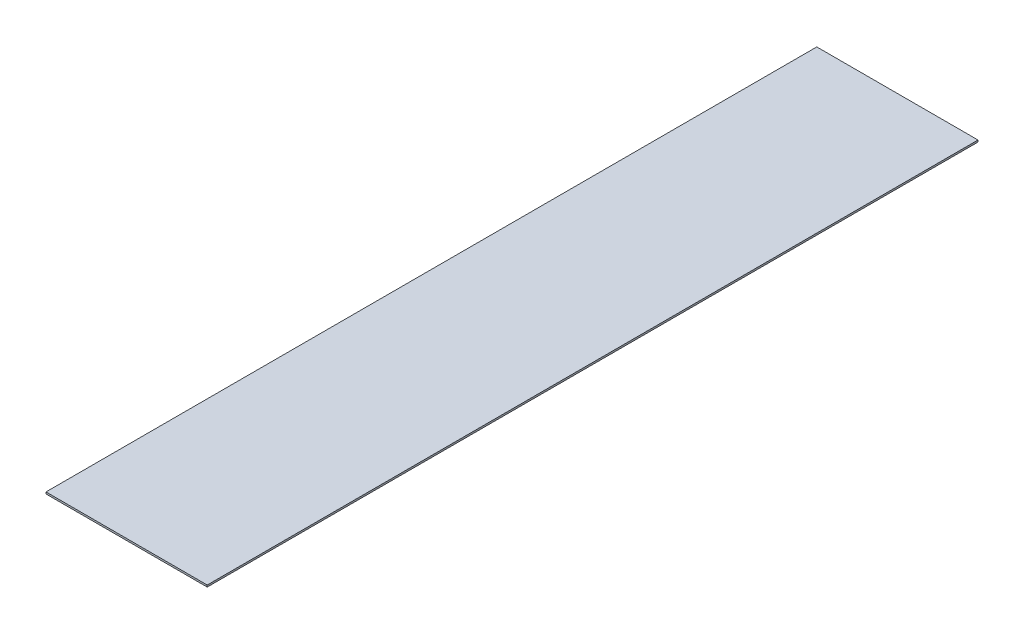
ISO-10303-21;
HEADER;
FILE_DESCRIPTION(('STEP AP214'),'2;1');
FILE_NAME('part.step','',(''),(''),'','','');
FILE_SCHEMA(('AUTOMOTIVE_DESIGN { 1 0 10303 214 1 1 1 1 }'));
ENDSEC;
DATA;
#1=APPLICATION_CONTEXT('core data for automotive mechanical design processes');
#2=APPLICATION_PROTOCOL_DEFINITION('international standard','automotive_design',2000,#1);
#3=PRODUCT_CONTEXT('',#1,'mechanical');
#4=PRODUCT('Part','Part','',(#3));
#5=PRODUCT_RELATED_PRODUCT_CATEGORY('part','',(#4));
#6=PRODUCT_DEFINITION_FORMATION('','',#4);
#7=PRODUCT_DEFINITION_CONTEXT('part definition',#1,'design');
#8=PRODUCT_DEFINITION('design','',#6,#7);
#9=PRODUCT_DEFINITION_SHAPE('','',#8);
#10=(LENGTH_UNIT() NAMED_UNIT(*) SI_UNIT(.MILLI.,.METRE.));
#11=(NAMED_UNIT(*) PLANE_ANGLE_UNIT() SI_UNIT($,.RADIAN.));
#12=(NAMED_UNIT(*) SI_UNIT($,.STERADIAN.) SOLID_ANGLE_UNIT());
#13=UNCERTAINTY_MEASURE_WITH_UNIT(LENGTH_MEASURE(1.E-05),#10,'distance_accuracy_value','');
#14=(GEOMETRIC_REPRESENTATION_CONTEXT(3) GLOBAL_UNCERTAINTY_ASSIGNED_CONTEXT((#13)) GLOBAL_UNIT_ASSIGNED_CONTEXT((#10,
#11,#12)) REPRESENTATION_CONTEXT('',''));
#15=CARTESIAN_POINT('',(0.,0.,0.));
#16=DIRECTION('',(0.,0.,1.));
#17=DIRECTION('',(1.,0.,0.));
#18=AXIS2_PLACEMENT_3D('',#15,#16,#17);
#19=CARTESIAN_POINT('',(44.45,1.,-212.5));
#20=DIRECTION('',(-1.,0.,0.));
#21=DIRECTION('',(0.,0.,1.));
#22=AXIS2_PLACEMENT_3D('',#19,#20,#21);
#23=PLANE('',#22);
#24=DIRECTION('',(0.,0.,-1.));
#25=VECTOR('',#24,1.);
#26=CARTESIAN_POINT('',(44.45,0.,-212.5));
#27=LINE('',#26,#25);
#28=CARTESIAN_POINT('',(44.45,0.,212.5));
#29=VERTEX_POINT('',#28);
#30=CARTESIAN_POINT('',(44.45,0.,-212.5));
#31=VERTEX_POINT('',#30);
#32=EDGE_CURVE('E96',#29,#31,#27,.T.);
#33=ORIENTED_EDGE('',*,*,#32,.T.);
#34=DIRECTION('',(0.,-1.,0.));
#35=VECTOR('',#34,1.);
#36=CARTESIAN_POINT('',(44.45,1.,-212.5));
#37=LINE('',#36,#35);
#38=CARTESIAN_POINT('',(44.45,1.,-212.5));
#39=VERTEX_POINT('',#38);
#40=EDGE_CURVE('E11',#39,#31,#37,.T.);
#41=ORIENTED_EDGE('',*,*,#40,.F.);
#42=DIRECTION('',(0.,0.,-1.));
#43=VECTOR('',#42,1.);
#44=CARTESIAN_POINT('',(44.45,1.,-212.5));
#45=LINE('',#44,#43);
#46=CARTESIAN_POINT('',(44.45,1.,212.5));
#47=VERTEX_POINT('',#46);
#48=EDGE_CURVE('E84',#47,#39,#45,.T.);
#49=ORIENTED_EDGE('',*,*,#48,.F.);
#50=DIRECTION('',(0.,-1.,0.));
#51=VECTOR('',#50,1.);
#52=CARTESIAN_POINT('',(44.45,1.,212.5));
#53=LINE('',#52,#51);
#54=EDGE_CURVE('E92',#47,#29,#53,.T.);
#55=ORIENTED_EDGE('',*,*,#54,.T.);
#56=EDGE_LOOP('',(#33,#41,#49,#55));
#57=FACE_BOUND('',#56,.T.);
#58=ADVANCED_FACE('F33',(#57),#23,.F.);
#59=CARTESIAN_POINT('',(-44.45,1.,-212.5));
#60=DIRECTION('',(0.,0.,1.));
#61=DIRECTION('',(1.,0.,0.));
#62=AXIS2_PLACEMENT_3D('',#59,#60,#61);
#63=PLANE('',#62);
#64=DIRECTION('',(-1.,0.,0.));
#65=VECTOR('',#64,1.);
#66=CARTESIAN_POINT('',(-44.45,0.,-212.5));
#67=LINE('',#66,#65);
#68=CARTESIAN_POINT('',(-44.45,0.,-212.5));
#69=VERTEX_POINT('',#68);
#70=EDGE_CURVE('E88',#31,#69,#67,.T.);
#71=ORIENTED_EDGE('',*,*,#70,.T.);
#72=DIRECTION('',(0.,-1.,0.));
#73=VECTOR('',#72,1.);
#74=CARTESIAN_POINT('',(-44.45,1.,-212.5));
#75=LINE('',#74,#73);
#76=CARTESIAN_POINT('',(-44.45,1.,-212.5));
#77=VERTEX_POINT('',#76);
#78=EDGE_CURVE('E41',#77,#69,#75,.T.);
#79=ORIENTED_EDGE('',*,*,#78,.F.);
#80=DIRECTION('',(-1.,0.,0.));
#81=VECTOR('',#80,1.);
#82=CARTESIAN_POINT('',(-44.45,1.,-212.5));
#83=LINE('',#82,#81);
#84=EDGE_CURVE('E79',#39,#77,#83,.T.);
#85=ORIENTED_EDGE('',*,*,#84,.F.);
#86=ORIENTED_EDGE('',*,*,#40,.T.);
#87=EDGE_LOOP('',(#71,#79,#85,#86));
#88=FACE_BOUND('',#87,.T.);
#89=ADVANCED_FACE('F87',(#88),#63,.F.);
#90=CARTESIAN_POINT('',(-44.45,1.,-212.5));
#91=DIRECTION('',(1.,0.,0.));
#92=DIRECTION('',(0.,0.,-1.));
#93=AXIS2_PLACEMENT_3D('',#90,#91,#92);
#94=PLANE('',#93);
#95=DIRECTION('',(0.,0.,1.));
#96=VECTOR('',#95,1.);
#97=CARTESIAN_POINT('',(-44.45,0.,-212.5));
#98=LINE('',#97,#96);
#99=CARTESIAN_POINT('',(-44.45,0.,212.5));
#100=VERTEX_POINT('',#99);
#101=EDGE_CURVE('E66',#69,#100,#98,.T.);
#102=ORIENTED_EDGE('',*,*,#101,.T.);
#103=DIRECTION('',(0.,-1.,0.));
#104=VECTOR('',#103,1.);
#105=CARTESIAN_POINT('',(-44.45,1.,212.5));
#106=LINE('',#105,#104);
#107=CARTESIAN_POINT('',(-44.45,1.,212.5));
#108=VERTEX_POINT('',#107);
#109=EDGE_CURVE('E89',#108,#100,#106,.T.);
#110=ORIENTED_EDGE('',*,*,#109,.F.);
#111=DIRECTION('',(0.,0.,1.));
#112=VECTOR('',#111,1.);
#113=CARTESIAN_POINT('',(-44.45,1.,-212.5));
#114=LINE('',#113,#112);
#115=EDGE_CURVE('E82',#77,#108,#114,.T.);
#116=ORIENTED_EDGE('',*,*,#115,.F.);
#117=ORIENTED_EDGE('',*,*,#78,.T.);
#118=EDGE_LOOP('',(#102,#110,#116,#117));
#119=FACE_BOUND('',#118,.T.);
#120=ADVANCED_FACE('F90',(#119),#94,.F.);
#121=CARTESIAN_POINT('',(-44.45,1.,212.5));
#122=DIRECTION('',(0.,0.,-1.));
#123=DIRECTION('',(-1.,0.,0.));
#124=AXIS2_PLACEMENT_3D('',#121,#122,#123);
#125=PLANE('',#124);
#126=DIRECTION('',(1.,0.,0.));
#127=VECTOR('',#126,1.);
#128=CARTESIAN_POINT('',(-44.45,0.,212.5));
#129=LINE('',#128,#127);
#130=EDGE_CURVE('E72',#100,#29,#129,.T.);
#131=ORIENTED_EDGE('',*,*,#130,.T.);
#132=ORIENTED_EDGE('',*,*,#54,.F.);
#133=DIRECTION('',(1.,0.,0.));
#134=VECTOR('',#133,1.);
#135=CARTESIAN_POINT('',(-44.45,1.,212.5));
#136=LINE('',#135,#134);
#137=EDGE_CURVE('E49',#108,#47,#136,.T.);
#138=ORIENTED_EDGE('',*,*,#137,.F.);
#139=ORIENTED_EDGE('',*,*,#109,.T.);
#140=EDGE_LOOP('',(#131,#132,#138,#139));
#141=FACE_BOUND('',#140,.T.);
#142=ADVANCED_FACE('F103',(#141),#125,.F.);
#143=CARTESIAN_POINT('',(0.,1.,0.));
#144=DIRECTION('',(0.,1.,0.));
#145=DIRECTION('',(0.,0.,1.));
#146=AXIS2_PLACEMENT_3D('',#143,#144,#145);
#147=PLANE('',#146);
#148=ORIENTED_EDGE('',*,*,#48,.T.);
#149=ORIENTED_EDGE('',*,*,#84,.T.);
#150=ORIENTED_EDGE('',*,*,#115,.T.);
#151=ORIENTED_EDGE('',*,*,#137,.T.);
#152=EDGE_LOOP('',(#148,#149,#150,#151));
#153=FACE_BOUND('',#152,.T.);
#154=ADVANCED_FACE('F80',(#153),#147,.T.);
#155=CARTESIAN_POINT('',(0.,0.,0.));
#156=DIRECTION('',(0.,1.,0.));
#157=DIRECTION('',(0.,0.,1.));
#158=AXIS2_PLACEMENT_3D('',#155,#156,#157);
#159=PLANE('',#158);
#160=ORIENTED_EDGE('',*,*,#32,.F.);
#161=ORIENTED_EDGE('',*,*,#130,.F.);
#162=ORIENTED_EDGE('',*,*,#101,.F.);
#163=ORIENTED_EDGE('',*,*,#70,.F.);
#164=EDGE_LOOP('',(#160,#161,#162,#163));
#165=FACE_BOUND('',#164,.T.);
#166=ADVANCED_FACE('F106',(#165),#159,.F.);
#167=CLOSED_SHELL('',(#58,#89,#120,#142,#154,#166));
#168=MANIFOLD_SOLID_BREP('B2',#167);
#169=ADVANCED_BREP_SHAPE_REPRESENTATION('',(#18,#168),#14);
#170=SHAPE_DEFINITION_REPRESENTATION(#9,#169);
ENDSEC;
END-ISO-10303-21;
